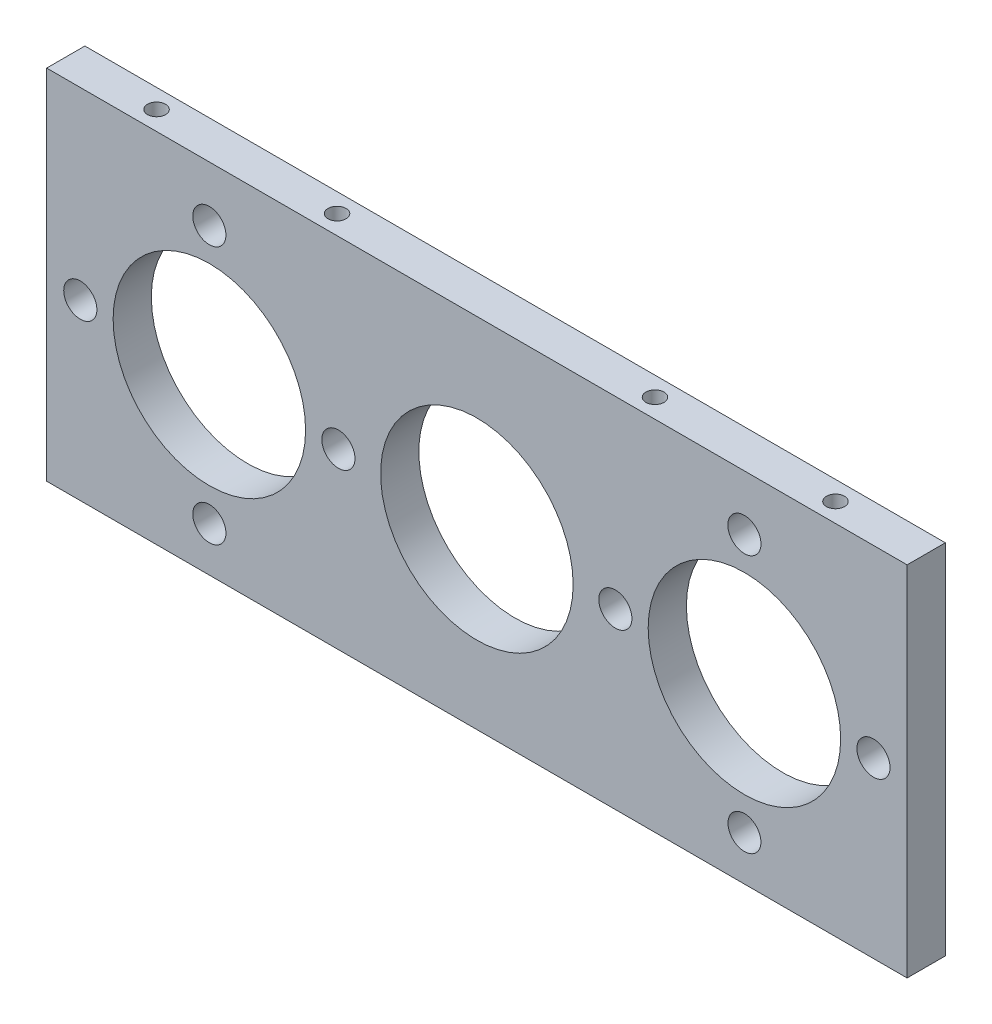
ISO-10303-21;
HEADER;
FILE_DESCRIPTION(('STEP AP214'),'2;1');
FILE_NAME('part.step','',(''),(''),'','','');
FILE_SCHEMA(('AUTOMOTIVE_DESIGN { 1 0 10303 214 1 1 1 1 }'));
ENDSEC;
DATA;
#1=APPLICATION_CONTEXT('core data for automotive mechanical design processes');
#2=APPLICATION_PROTOCOL_DEFINITION('international standard','automotive_design',2000,#1);
#3=PRODUCT_CONTEXT('',#1,'mechanical');
#4=PRODUCT('Part','Part','',(#3));
#5=PRODUCT_RELATED_PRODUCT_CATEGORY('part','',(#4));
#6=PRODUCT_DEFINITION_FORMATION('','',#4);
#7=PRODUCT_DEFINITION_CONTEXT('part definition',#1,'design');
#8=PRODUCT_DEFINITION('design','',#6,#7);
#9=PRODUCT_DEFINITION_SHAPE('','',#8);
#10=(LENGTH_UNIT() NAMED_UNIT(*) SI_UNIT(.MILLI.,.METRE.));
#11=(NAMED_UNIT(*) PLANE_ANGLE_UNIT() SI_UNIT($,.RADIAN.));
#12=(NAMED_UNIT(*) SI_UNIT($,.STERADIAN.) SOLID_ANGLE_UNIT());
#13=UNCERTAINTY_MEASURE_WITH_UNIT(LENGTH_MEASURE(1.E-05),#10,'distance_accuracy_value','');
#14=(GEOMETRIC_REPRESENTATION_CONTEXT(3) GLOBAL_UNCERTAINTY_ASSIGNED_CONTEXT((#13)) GLOBAL_UNIT_ASSIGNED_CONTEXT((#10,
#11,#12)) REPRESENTATION_CONTEXT('',''));
#15=CARTESIAN_POINT('',(0.,0.,0.));
#16=DIRECTION('',(0.,0.,1.));
#17=DIRECTION('',(1.,0.,0.));
#18=AXIS2_PLACEMENT_3D('',#15,#16,#17);
#19=CARTESIAN_POINT('',(-71.505,27.025,6.35));
#20=DIRECTION('',(1.,0.,0.));
#21=DIRECTION('',(0.,0.,-1.));
#22=AXIS2_PLACEMENT_3D('',#19,#20,#21);
#23=PLANE('',#22);
#24=DIRECTION('',(0.,-1.,0.));
#25=VECTOR('',#24,1.);
#26=CARTESIAN_POINT('',(-71.505,27.025,0.));
#27=LINE('',#26,#25);
#28=CARTESIAN_POINT('',(-71.505,32.445,0.));
#29=VERTEX_POINT('',#28);
#30=CARTESIAN_POINT('',(-71.505,-27.025,0.));
#31=VERTEX_POINT('',#30);
#32=EDGE_CURVE('E67',#29,#31,#27,.T.);
#33=ORIENTED_EDGE('',*,*,#32,.T.);
#34=DIRECTION('',(0.,0.,-1.));
#35=VECTOR('',#34,1.);
#36=CARTESIAN_POINT('',(-71.505,-27.025,6.35));
#37=LINE('',#36,#35);
#38=CARTESIAN_POINT('',(-71.505,-27.025,6.35));
#39=VERTEX_POINT('',#38);
#40=EDGE_CURVE('E11',#39,#31,#37,.T.);
#41=ORIENTED_EDGE('',*,*,#40,.F.);
#42=DIRECTION('',(0.,-1.,0.));
#43=VECTOR('',#42,1.);
#44=CARTESIAN_POINT('',(-71.505,27.025,6.35));
#45=LINE('',#44,#43);
#46=CARTESIAN_POINT('',(-71.505,32.445,6.35));
#47=VERTEX_POINT('',#46);
#48=EDGE_CURVE('E77',#47,#39,#45,.T.);
#49=ORIENTED_EDGE('',*,*,#48,.F.);
#50=DIRECTION('',(0.,0.,1.));
#51=VECTOR('',#50,1.);
#52=CARTESIAN_POINT('',(-71.505,32.445,0.));
#53=LINE('',#52,#51);
#54=EDGE_CURVE('E79',#29,#47,#53,.T.);
#55=ORIENTED_EDGE('',*,*,#54,.F.);
#56=EDGE_LOOP('',(#33,#41,#49,#55));
#57=FACE_BOUND('',#56,.T.);
#58=ADVANCED_FACE('F34',(#57),#23,.F.);
#59=CARTESIAN_POINT('',(-71.505,-27.025,6.35));
#60=DIRECTION('',(0.,1.,0.));
#61=DIRECTION('',(0.,0.,1.));
#62=AXIS2_PLACEMENT_3D('',#59,#60,#61);
#63=PLANE('',#62);
#64=DIRECTION('',(1.,0.,0.));
#65=VECTOR('',#64,1.);
#66=CARTESIAN_POINT('',(-71.505,-27.025,0.));
#67=LINE('',#66,#65);
#68=CARTESIAN_POINT('',(71.505,-27.025,0.));
#69=VERTEX_POINT('',#68);
#70=EDGE_CURVE('E62',#31,#69,#67,.T.);
#71=ORIENTED_EDGE('',*,*,#70,.T.);
#72=DIRECTION('',(0.,0.,-1.));
#73=VECTOR('',#72,1.);
#74=CARTESIAN_POINT('',(71.505,-27.025,6.35));
#75=LINE('',#74,#73);
#76=CARTESIAN_POINT('',(71.505,-27.025,6.35));
#77=VERTEX_POINT('',#76);
#78=EDGE_CURVE('E43',#77,#69,#75,.T.);
#79=ORIENTED_EDGE('',*,*,#78,.F.);
#80=DIRECTION('',(1.,0.,0.));
#81=VECTOR('',#80,1.);
#82=CARTESIAN_POINT('',(-71.505,-27.025,6.35));
#83=LINE('',#82,#81);
#84=EDGE_CURVE('E51',#39,#77,#83,.T.);
#85=ORIENTED_EDGE('',*,*,#84,.F.);
#86=ORIENTED_EDGE('',*,*,#40,.T.);
#87=EDGE_LOOP('',(#71,#79,#85,#86));
#88=FACE_BOUND('',#87,.T.);
#89=ADVANCED_FACE('F195',(#88),#63,.F.);
#90=CARTESIAN_POINT('',(71.505,27.025,6.35));
#91=DIRECTION('',(-1.,0.,0.));
#92=DIRECTION('',(0.,0.,1.));
#93=AXIS2_PLACEMENT_3D('',#90,#91,#92);
#94=PLANE('',#93);
#95=DIRECTION('',(0.,1.,0.));
#96=VECTOR('',#95,1.);
#97=CARTESIAN_POINT('',(71.505,27.025,0.));
#98=LINE('',#97,#96);
#99=CARTESIAN_POINT('',(71.505,32.445,0.));
#100=VERTEX_POINT('',#99);
#101=EDGE_CURVE('E82',#69,#100,#98,.T.);
#102=ORIENTED_EDGE('',*,*,#101,.T.);
#103=DIRECTION('',(0.,0.,1.));
#104=VECTOR('',#103,1.);
#105=CARTESIAN_POINT('',(71.505,32.445,0.));
#106=LINE('',#105,#104);
#107=CARTESIAN_POINT('',(71.505,32.445,6.35));
#108=VERTEX_POINT('',#107);
#109=EDGE_CURVE('E91',#100,#108,#106,.T.);
#110=ORIENTED_EDGE('',*,*,#109,.T.);
#111=DIRECTION('',(0.,1.,0.));
#112=VECTOR('',#111,1.);
#113=CARTESIAN_POINT('',(71.505,27.025,6.35));
#114=LINE('',#113,#112);
#115=EDGE_CURVE('E95',#77,#108,#114,.T.);
#116=ORIENTED_EDGE('',*,*,#115,.F.);
#117=ORIENTED_EDGE('',*,*,#78,.T.);
#118=EDGE_LOOP('',(#102,#110,#116,#117));
#119=FACE_BOUND('',#118,.T.);
#120=ADVANCED_FACE('F175',(#119),#94,.F.);
#121=CARTESIAN_POINT('',(-71.505,-27.025,6.35));
#122=DIRECTION('',(0.,0.,1.));
#123=DIRECTION('',(1.,0.,0.));
#124=AXIS2_PLACEMENT_3D('',#121,#122,#123);
#125=PLANE('',#124);
#126=CARTESIAN_POINT('',(-0.00186307186936935,1.8418504493771,6.35));
#127=DIRECTION('',(0.,0.,1.));
#128=DIRECTION('',(1.,0.,0.));
#129=AXIS2_PLACEMENT_3D('',#126,#127,#128);
#130=CIRCLE('',#129,16.);
#131=CARTESIAN_POINT('',(15.9981369281306,1.8418504493771,6.35));
#132=VERTEX_POINT('',#131);
#133=EDGE_CURVE('E90',#132,#132,#130,.T.);
#134=ORIENTED_EDGE('',*,*,#133,.F.);
#135=EDGE_LOOP('',(#134));
#136=FACE_BOUND('',#135,.T.);
#137=CARTESIAN_POINT('',(-44.4668630718694,1.84185044937741,6.35));
#138=DIRECTION('',(0.,0.,1.));
#139=DIRECTION('',(1.,0.,0.));
#140=AXIS2_PLACEMENT_3D('',#137,#138,#139);
#141=CIRCLE('',#140,15.995);
#142=CARTESIAN_POINT('',(-28.4718630718694,1.84185044937741,6.35));
#143=VERTEX_POINT('',#142);
#144=EDGE_CURVE('E111',#143,#143,#141,.T.);
#145=ORIENTED_EDGE('',*,*,#144,.F.);
#146=EDGE_LOOP('',(#145));
#147=FACE_BOUND('',#146,.T.);
#148=CARTESIAN_POINT('',(44.4631369281306,1.8418504493771,6.35));
#149=DIRECTION('',(0.,0.,1.));
#150=DIRECTION('',(1.,0.,0.));
#151=AXIS2_PLACEMENT_3D('',#148,#149,#150);
#152=CIRCLE('',#151,15.995);
#153=CARTESIAN_POINT('',(60.4581369281306,1.8418504493771,6.35));
#154=VERTEX_POINT('',#153);
#155=EDGE_CURVE('E117',#154,#154,#152,.T.);
#156=ORIENTED_EDGE('',*,*,#155,.F.);
#157=EDGE_LOOP('',(#156));
#158=FACE_BOUND('',#157,.T.);
#159=CARTESIAN_POINT('',(-44.4668630718693,23.2918504493774,6.35));
#160=DIRECTION('',(0.,0.,1.));
#161=DIRECTION('',(1.,0.,0.));
#162=AXIS2_PLACEMENT_3D('',#159,#160,#161);
#163=CIRCLE('',#162,2.755);
#164=CARTESIAN_POINT('',(-41.7118630718693,23.2918504493774,6.35));
#165=VERTEX_POINT('',#164);
#166=EDGE_CURVE('E123',#165,#165,#163,.F.);
#167=ORIENTED_EDGE('',*,*,#166,.T.);
#168=EDGE_LOOP('',(#167));
#169=FACE_BOUND('',#168,.T.);
#170=CARTESIAN_POINT('',(-65.9168630718694,1.84185044937741,6.35));
#171=DIRECTION('',(0.,0.,1.));
#172=DIRECTION('',(1.,0.,0.));
#173=AXIS2_PLACEMENT_3D('',#170,#171,#172);
#174=CIRCLE('',#173,2.75500000000001);
#175=CARTESIAN_POINT('',(-63.1618630718694,1.84185044937741,6.35));
#176=VERTEX_POINT('',#175);
#177=EDGE_CURVE('E129',#176,#176,#174,.F.);
#178=ORIENTED_EDGE('',*,*,#177,.T.);
#179=EDGE_LOOP('',(#178));
#180=FACE_BOUND('',#179,.T.);
#181=CARTESIAN_POINT('',(-44.4668630718696,-19.6081495506226,6.35));
#182=DIRECTION('',(0.,0.,1.));
#183=DIRECTION('',(1.,0.,0.));
#184=AXIS2_PLACEMENT_3D('',#181,#182,#183);
#185=CIRCLE('',#184,2.755);
#186=CARTESIAN_POINT('',(-41.7118630718696,-19.6081495506226,6.35));
#187=VERTEX_POINT('',#186);
#188=EDGE_CURVE('E135',#187,#187,#185,.F.);
#189=ORIENTED_EDGE('',*,*,#188,.T.);
#190=EDGE_LOOP('',(#189));
#191=FACE_BOUND('',#190,.T.);
#192=CARTESIAN_POINT('',(-23.0168630718694,1.84185044937726,6.35));
#193=DIRECTION('',(0.,0.,1.));
#194=DIRECTION('',(1.,0.,0.));
#195=AXIS2_PLACEMENT_3D('',#192,#193,#194);
#196=CIRCLE('',#195,2.755);
#197=CARTESIAN_POINT('',(-20.2618630718694,1.84185044937726,6.35));
#198=VERTEX_POINT('',#197);
#199=EDGE_CURVE('E141',#198,#198,#196,.F.);
#200=ORIENTED_EDGE('',*,*,#199,.T.);
#201=EDGE_LOOP('',(#200));
#202=FACE_BOUND('',#201,.T.);
#203=CARTESIAN_POINT('',(23.0131369281306,1.8418504493771,6.35));
#204=DIRECTION('',(0.,0.,1.));
#205=DIRECTION('',(1.,0.,0.));
#206=AXIS2_PLACEMENT_3D('',#203,#204,#205);
#207=CIRCLE('',#206,2.755);
#208=CARTESIAN_POINT('',(25.7681369281306,1.8418504493771,6.35));
#209=VERTEX_POINT('',#208);
#210=EDGE_CURVE('E147',#209,#209,#207,.F.);
#211=ORIENTED_EDGE('',*,*,#210,.T.);
#212=EDGE_LOOP('',(#211));
#213=FACE_BOUND('',#212,.T.);
#214=CARTESIAN_POINT('',(44.4631369281304,-19.6081495506229,6.35));
#215=DIRECTION('',(0.,0.,1.));
#216=DIRECTION('',(1.,0.,0.));
#217=AXIS2_PLACEMENT_3D('',#214,#215,#216);
#218=CIRCLE('',#217,2.73569173748039);
#219=CARTESIAN_POINT('',(47.1988286656108,-19.6081495506229,6.35));
#220=VERTEX_POINT('',#219);
#221=EDGE_CURVE('E153',#220,#220,#218,.F.);
#222=ORIENTED_EDGE('',*,*,#221,.T.);
#223=EDGE_LOOP('',(#222));
#224=FACE_BOUND('',#223,.T.);
#225=CARTESIAN_POINT('',(65.9131369281306,1.84185044937695,6.35));
#226=DIRECTION('',(0.,0.,1.));
#227=DIRECTION('',(1.,0.,0.));
#228=AXIS2_PLACEMENT_3D('',#225,#226,#227);
#229=CIRCLE('',#228,2.75556539322486);
#230=CARTESIAN_POINT('',(68.6687023213555,1.84185044937695,6.35));
#231=VERTEX_POINT('',#230);
#232=EDGE_CURVE('E159',#231,#231,#229,.F.);
#233=ORIENTED_EDGE('',*,*,#232,.T.);
#234=EDGE_LOOP('',(#233));
#235=FACE_BOUND('',#234,.T.);
#236=CARTESIAN_POINT('',(44.4631369281307,23.2918504493771,6.35));
#237=DIRECTION('',(0.,0.,1.));
#238=DIRECTION('',(1.,0.,0.));
#239=AXIS2_PLACEMENT_3D('',#236,#237,#238);
#240=CIRCLE('',#239,2.755);
#241=CARTESIAN_POINT('',(47.2181369281307,23.2918504493771,6.35));
#242=VERTEX_POINT('',#241);
#243=EDGE_CURVE('E165',#242,#242,#240,.F.);
#244=ORIENTED_EDGE('',*,*,#243,.T.);
#245=EDGE_LOOP('',(#244));
#246=FACE_BOUND('',#245,.T.);
#247=ORIENTED_EDGE('',*,*,#48,.T.);
#248=ORIENTED_EDGE('',*,*,#84,.T.);
#249=ORIENTED_EDGE('',*,*,#115,.T.);
#250=DIRECTION('',(-1.,0.,0.));
#251=VECTOR('',#250,1.);
#252=CARTESIAN_POINT('',(-71.505,32.445,6.35));
#253=LINE('',#252,#251);
#254=EDGE_CURVE('E88',#108,#47,#253,.T.);
#255=ORIENTED_EDGE('',*,*,#254,.T.);
#256=EDGE_LOOP('',(#247,#248,#249,#255));
#257=FACE_BOUND('',#256,.T.);
#258=ADVANCED_FACE('F93',(#136,#147,#158,#169,#180,#191,#202,#213,#224,#235,#246,#257),#125,.T.);
#259=CARTESIAN_POINT('',(-71.505,-27.025,0.));
#260=DIRECTION('',(0.,0.,1.));
#261=DIRECTION('',(1.,0.,0.));
#262=AXIS2_PLACEMENT_3D('',#259,#260,#261);
#263=PLANE('',#262);
#264=CARTESIAN_POINT('',(-0.00186307186936935,1.8418504493771,0.));
#265=DIRECTION('',(0.,0.,1.));
#266=DIRECTION('',(1.,0.,0.));
#267=AXIS2_PLACEMENT_3D('',#264,#265,#266);
#268=CIRCLE('',#267,16.);
#269=CARTESIAN_POINT('',(15.9981369281306,1.8418504493771,0.));
#270=VERTEX_POINT('',#269);
#271=EDGE_CURVE('E37',#270,#270,#268,.T.);
#272=ORIENTED_EDGE('',*,*,#271,.T.);
#273=EDGE_LOOP('',(#272));
#274=FACE_BOUND('',#273,.T.);
#275=CARTESIAN_POINT('',(-44.4668630718694,1.84185044937741,0.));
#276=DIRECTION('',(0.,0.,-1.));
#277=DIRECTION('',(-1.,0.,0.));
#278=AXIS2_PLACEMENT_3D('',#275,#276,#277);
#279=CIRCLE('',#278,15.995);
#280=CARTESIAN_POINT('',(-60.4618630718694,1.84185044937741,0.));
#281=VERTEX_POINT('',#280);
#282=EDGE_CURVE('E108',#281,#281,#279,.T.);
#283=ORIENTED_EDGE('',*,*,#282,.F.);
#284=EDGE_LOOP('',(#283));
#285=FACE_BOUND('',#284,.T.);
#286=CARTESIAN_POINT('',(44.4631369281306,1.8418504493771,0.));
#287=DIRECTION('',(0.,0.,-1.));
#288=DIRECTION('',(-1.,0.,0.));
#289=AXIS2_PLACEMENT_3D('',#286,#287,#288);
#290=CIRCLE('',#289,15.995);
#291=CARTESIAN_POINT('',(28.4681369281306,1.8418504493771,0.));
#292=VERTEX_POINT('',#291);
#293=EDGE_CURVE('E114',#292,#292,#290,.T.);
#294=ORIENTED_EDGE('',*,*,#293,.F.);
#295=EDGE_LOOP('',(#294));
#296=FACE_BOUND('',#295,.T.);
#297=CARTESIAN_POINT('',(-44.4668630718693,23.2918504493774,0.));
#298=DIRECTION('',(0.,0.,-1.));
#299=DIRECTION('',(-1.,0.,0.));
#300=AXIS2_PLACEMENT_3D('',#297,#298,#299);
#301=CIRCLE('',#300,2.755);
#302=CARTESIAN_POINT('',(-47.2218630718693,23.2918504493774,0.));
#303=VERTEX_POINT('',#302);
#304=EDGE_CURVE('E120',#303,#303,#301,.T.);
#305=ORIENTED_EDGE('',*,*,#304,.F.);
#306=EDGE_LOOP('',(#305));
#307=FACE_BOUND('',#306,.T.);
#308=CARTESIAN_POINT('',(-65.9168630718694,1.84185044937741,0.));
#309=DIRECTION('',(0.,0.,-1.));
#310=DIRECTION('',(-1.,0.,0.));
#311=AXIS2_PLACEMENT_3D('',#308,#309,#310);
#312=CIRCLE('',#311,2.75500000000001);
#313=CARTESIAN_POINT('',(-68.6718630718694,1.84185044937741,0.));
#314=VERTEX_POINT('',#313);
#315=EDGE_CURVE('E126',#314,#314,#312,.T.);
#316=ORIENTED_EDGE('',*,*,#315,.F.);
#317=EDGE_LOOP('',(#316));
#318=FACE_BOUND('',#317,.T.);
#319=CARTESIAN_POINT('',(-44.4668630718696,-19.6081495506226,0.));
#320=DIRECTION('',(0.,0.,-1.));
#321=DIRECTION('',(-1.,0.,0.));
#322=AXIS2_PLACEMENT_3D('',#319,#320,#321);
#323=CIRCLE('',#322,2.755);
#324=CARTESIAN_POINT('',(-47.2218630718696,-19.6081495506226,0.));
#325=VERTEX_POINT('',#324);
#326=EDGE_CURVE('E132',#325,#325,#323,.T.);
#327=ORIENTED_EDGE('',*,*,#326,.F.);
#328=EDGE_LOOP('',(#327));
#329=FACE_BOUND('',#328,.T.);
#330=CARTESIAN_POINT('',(-23.0168630718694,1.84185044937726,0.));
#331=DIRECTION('',(0.,0.,-1.));
#332=DIRECTION('',(-1.,0.,0.));
#333=AXIS2_PLACEMENT_3D('',#330,#331,#332);
#334=CIRCLE('',#333,2.755);
#335=CARTESIAN_POINT('',(-25.7718630718694,1.84185044937726,0.));
#336=VERTEX_POINT('',#335);
#337=EDGE_CURVE('E138',#336,#336,#334,.T.);
#338=ORIENTED_EDGE('',*,*,#337,.F.);
#339=EDGE_LOOP('',(#338));
#340=FACE_BOUND('',#339,.T.);
#341=CARTESIAN_POINT('',(23.0131369281306,1.8418504493771,0.));
#342=DIRECTION('',(0.,0.,-1.));
#343=DIRECTION('',(-1.,0.,0.));
#344=AXIS2_PLACEMENT_3D('',#341,#342,#343);
#345=CIRCLE('',#344,2.755);
#346=CARTESIAN_POINT('',(20.2581369281306,1.8418504493771,0.));
#347=VERTEX_POINT('',#346);
#348=EDGE_CURVE('E144',#347,#347,#345,.T.);
#349=ORIENTED_EDGE('',*,*,#348,.F.);
#350=EDGE_LOOP('',(#349));
#351=FACE_BOUND('',#350,.T.);
#352=CARTESIAN_POINT('',(44.4631369281304,-19.6081495506229,0.));
#353=DIRECTION('',(0.,0.,-1.));
#354=DIRECTION('',(-1.,0.,0.));
#355=AXIS2_PLACEMENT_3D('',#352,#353,#354);
#356=CIRCLE('',#355,2.73569173748039);
#357=CARTESIAN_POINT('',(41.72744519065,-19.6081495506229,0.));
#358=VERTEX_POINT('',#357);
#359=EDGE_CURVE('E150',#358,#358,#356,.T.);
#360=ORIENTED_EDGE('',*,*,#359,.F.);
#361=EDGE_LOOP('',(#360));
#362=FACE_BOUND('',#361,.T.);
#363=CARTESIAN_POINT('',(65.9131369281306,1.84185044937695,0.));
#364=DIRECTION('',(0.,0.,-1.));
#365=DIRECTION('',(-1.,0.,0.));
#366=AXIS2_PLACEMENT_3D('',#363,#364,#365);
#367=CIRCLE('',#366,2.75556539322486);
#368=CARTESIAN_POINT('',(63.1575715349058,1.84185044937695,0.));
#369=VERTEX_POINT('',#368);
#370=EDGE_CURVE('E156',#369,#369,#367,.T.);
#371=ORIENTED_EDGE('',*,*,#370,.F.);
#372=EDGE_LOOP('',(#371));
#373=FACE_BOUND('',#372,.T.);
#374=CARTESIAN_POINT('',(44.4631369281307,23.2918504493771,0.));
#375=DIRECTION('',(0.,0.,-1.));
#376=DIRECTION('',(-1.,0.,0.));
#377=AXIS2_PLACEMENT_3D('',#374,#375,#376);
#378=CIRCLE('',#377,2.755);
#379=CARTESIAN_POINT('',(41.7081369281307,23.2918504493771,0.));
#380=VERTEX_POINT('',#379);
#381=EDGE_CURVE('E162',#380,#380,#378,.T.);
#382=ORIENTED_EDGE('',*,*,#381,.F.);
#383=EDGE_LOOP('',(#382));
#384=FACE_BOUND('',#383,.T.);
#385=ORIENTED_EDGE('',*,*,#32,.F.);
#386=DIRECTION('',(-1.,0.,0.));
#387=VECTOR('',#386,1.);
#388=CARTESIAN_POINT('',(-71.505,32.445,0.));
#389=LINE('',#388,#387);
#390=EDGE_CURVE('E89',#100,#29,#389,.T.);
#391=ORIENTED_EDGE('',*,*,#390,.F.);
#392=ORIENTED_EDGE('',*,*,#101,.F.);
#393=ORIENTED_EDGE('',*,*,#70,.F.);
#394=EDGE_LOOP('',(#385,#391,#392,#393));
#395=FACE_BOUND('',#394,.T.);
#396=ADVANCED_FACE('F177',(#274,#285,#296,#307,#318,#329,#340,#351,#362,#373,#384,#395),#263,.F.);
#397=CARTESIAN_POINT('',(44.4631369281307,23.2918504493771,14.1439159022091));
#398=DIRECTION('',(0.,0.,-1.));
#399=DIRECTION('',(-1.,0.,0.));
#400=AXIS2_PLACEMENT_3D('',#397,#398,#399);
#401=CYLINDRICAL_SURFACE('',#400,2.755);
#402=ORIENTED_EDGE('',*,*,#381,.T.);
#403=EDGE_LOOP('',(#402));
#404=FACE_BOUND('',#403,.T.);
#405=ORIENTED_EDGE('',*,*,#243,.F.);
#406=EDGE_LOOP('',(#405));
#407=FACE_BOUND('',#406,.T.);
#408=ADVANCED_FACE('F179',(#404,#407),#401,.F.);
#409=CARTESIAN_POINT('',(65.9131369281306,1.84185044937695,14.1439159022091));
#410=DIRECTION('',(0.,0.,-1.));
#411=DIRECTION('',(-1.,0.,0.));
#412=AXIS2_PLACEMENT_3D('',#409,#410,#411);
#413=CYLINDRICAL_SURFACE('',#412,2.75556539322486);
#414=ORIENTED_EDGE('',*,*,#370,.T.);
#415=EDGE_LOOP('',(#414));
#416=FACE_BOUND('',#415,.T.);
#417=ORIENTED_EDGE('',*,*,#232,.F.);
#418=EDGE_LOOP('',(#417));
#419=FACE_BOUND('',#418,.T.);
#420=ADVANCED_FACE('F186',(#416,#419),#413,.F.);
#421=CARTESIAN_POINT('',(44.4631369281304,-19.6081495506229,14.1439159022091));
#422=DIRECTION('',(0.,0.,-1.));
#423=DIRECTION('',(-1.,0.,0.));
#424=AXIS2_PLACEMENT_3D('',#421,#422,#423);
#425=CYLINDRICAL_SURFACE('',#424,2.73569173748039);
#426=ORIENTED_EDGE('',*,*,#359,.T.);
#427=EDGE_LOOP('',(#426));
#428=FACE_BOUND('',#427,.T.);
#429=ORIENTED_EDGE('',*,*,#221,.F.);
#430=EDGE_LOOP('',(#429));
#431=FACE_BOUND('',#430,.T.);
#432=ADVANCED_FACE('F397',(#428,#431),#425,.F.);
#433=CARTESIAN_POINT('',(23.0131369281306,1.8418504493771,14.1439159022091));
#434=DIRECTION('',(0.,0.,-1.));
#435=DIRECTION('',(-1.,0.,0.));
#436=AXIS2_PLACEMENT_3D('',#433,#434,#435);
#437=CYLINDRICAL_SURFACE('',#436,2.755);
#438=ORIENTED_EDGE('',*,*,#348,.T.);
#439=EDGE_LOOP('',(#438));
#440=FACE_BOUND('',#439,.T.);
#441=ORIENTED_EDGE('',*,*,#210,.F.);
#442=EDGE_LOOP('',(#441));
#443=FACE_BOUND('',#442,.T.);
#444=ADVANCED_FACE('F389',(#440,#443),#437,.F.);
#445=CARTESIAN_POINT('',(-23.0168630718694,1.84185044937726,14.1439159022091));
#446=DIRECTION('',(0.,0.,-1.));
#447=DIRECTION('',(-1.,0.,0.));
#448=AXIS2_PLACEMENT_3D('',#445,#446,#447);
#449=CYLINDRICAL_SURFACE('',#448,2.755);
#450=ORIENTED_EDGE('',*,*,#337,.T.);
#451=EDGE_LOOP('',(#450));
#452=FACE_BOUND('',#451,.T.);
#453=ORIENTED_EDGE('',*,*,#199,.F.);
#454=EDGE_LOOP('',(#453));
#455=FACE_BOUND('',#454,.T.);
#456=ADVANCED_FACE('F381',(#452,#455),#449,.F.);
#457=CARTESIAN_POINT('',(-44.4668630718696,-19.6081495506226,14.1439159022091));
#458=DIRECTION('',(0.,0.,-1.));
#459=DIRECTION('',(-1.,0.,0.));
#460=AXIS2_PLACEMENT_3D('',#457,#458,#459);
#461=CYLINDRICAL_SURFACE('',#460,2.755);
#462=ORIENTED_EDGE('',*,*,#326,.T.);
#463=EDGE_LOOP('',(#462));
#464=FACE_BOUND('',#463,.T.);
#465=ORIENTED_EDGE('',*,*,#188,.F.);
#466=EDGE_LOOP('',(#465));
#467=FACE_BOUND('',#466,.T.);
#468=ADVANCED_FACE('F373',(#464,#467),#461,.F.);
#469=CARTESIAN_POINT('',(-65.9168630718694,1.84185044937741,14.1439159022091));
#470=DIRECTION('',(0.,0.,-1.));
#471=DIRECTION('',(-1.,0.,0.));
#472=AXIS2_PLACEMENT_3D('',#469,#470,#471);
#473=CYLINDRICAL_SURFACE('',#472,2.75500000000001);
#474=ORIENTED_EDGE('',*,*,#315,.T.);
#475=EDGE_LOOP('',(#474));
#476=FACE_BOUND('',#475,.T.);
#477=ORIENTED_EDGE('',*,*,#177,.F.);
#478=EDGE_LOOP('',(#477));
#479=FACE_BOUND('',#478,.T.);
#480=ADVANCED_FACE('F365',(#476,#479),#473,.F.);
#481=CARTESIAN_POINT('',(-44.4668630718693,23.2918504493774,14.1439159022091));
#482=DIRECTION('',(0.,0.,-1.));
#483=DIRECTION('',(-1.,0.,0.));
#484=AXIS2_PLACEMENT_3D('',#481,#482,#483);
#485=CYLINDRICAL_SURFACE('',#484,2.755);
#486=ORIENTED_EDGE('',*,*,#304,.T.);
#487=EDGE_LOOP('',(#486));
#488=FACE_BOUND('',#487,.T.);
#489=ORIENTED_EDGE('',*,*,#166,.F.);
#490=EDGE_LOOP('',(#489));
#491=FACE_BOUND('',#490,.T.);
#492=ADVANCED_FACE('F357',(#488,#491),#485,.F.);
#493=CARTESIAN_POINT('',(44.4631369281306,1.8418504493771,10.));
#494=DIRECTION('',(0.,0.,-1.));
#495=DIRECTION('',(-1.,0.,0.));
#496=AXIS2_PLACEMENT_3D('',#493,#494,#495);
#497=CYLINDRICAL_SURFACE('',#496,15.995);
#498=ORIENTED_EDGE('',*,*,#155,.T.);
#499=EDGE_LOOP('',(#498));
#500=FACE_BOUND('',#499,.T.);
#501=ORIENTED_EDGE('',*,*,#293,.T.);
#502=EDGE_LOOP('',(#501));
#503=FACE_BOUND('',#502,.T.);
#504=ADVANCED_FACE('F349',(#500,#503),#497,.F.);
#505=CARTESIAN_POINT('',(-44.4668630718694,1.84185044937741,10.));
#506=DIRECTION('',(0.,0.,-1.));
#507=DIRECTION('',(-1.,0.,0.));
#508=AXIS2_PLACEMENT_3D('',#505,#506,#507);
#509=CYLINDRICAL_SURFACE('',#508,15.995);
#510=ORIENTED_EDGE('',*,*,#144,.T.);
#511=EDGE_LOOP('',(#510));
#512=FACE_BOUND('',#511,.T.);
#513=ORIENTED_EDGE('',*,*,#282,.T.);
#514=EDGE_LOOP('',(#513));
#515=FACE_BOUND('',#514,.T.);
#516=ADVANCED_FACE('F344',(#512,#515),#509,.F.);
#517=CARTESIAN_POINT('',(-0.00186307186936935,1.8418504493771,-3.65));
#518=DIRECTION('',(0.,0.,1.));
#519=DIRECTION('',(1.,0.,0.));
#520=AXIS2_PLACEMENT_3D('',#517,#518,#519);
#521=CYLINDRICAL_SURFACE('',#520,16.);
#522=ORIENTED_EDGE('',*,*,#133,.T.);
#523=EDGE_LOOP('',(#522));
#524=FACE_BOUND('',#523,.T.);
#525=ORIENTED_EDGE('',*,*,#271,.F.);
#526=EDGE_LOOP('',(#525));
#527=FACE_BOUND('',#526,.T.);
#528=ADVANCED_FACE('F231',(#524,#527),#521,.F.);
#529=CARTESIAN_POINT('',(-71.505,32.445,0.));
#530=DIRECTION('',(0.,1.,0.));
#531=DIRECTION('',(0.,0.,1.));
#532=AXIS2_PLACEMENT_3D('',#529,#530,#531);
#533=PLANE('',#532);
#534=CARTESIAN_POINT('',(-56.423186497269,32.445,3.175));
#535=DIRECTION('',(0.,1.,0.));
#536=DIRECTION('',(0.,0.,-1.));
#537=AXIS2_PLACEMENT_3D('',#534,#535,#536);
#538=CIRCLE('',#537,1.5);
#539=CARTESIAN_POINT('',(-56.423186497269,32.445,1.67499999999999));
#540=VERTEX_POINT('',#539);
#541=EDGE_CURVE('E510',#540,#540,#538,.T.);
#542=ORIENTED_EDGE('',*,*,#541,.F.);
#543=EDGE_LOOP('',(#542));
#544=FACE_BOUND('',#543,.T.);
#545=CARTESIAN_POINT('',(-26.423186497269,32.445,3.17499999999999));
#546=DIRECTION('',(0.,1.,0.));
#547=DIRECTION('',(0.,0.,-1.));
#548=AXIS2_PLACEMENT_3D('',#545,#546,#547);
#549=CIRCLE('',#548,1.5);
#550=CARTESIAN_POINT('',(-26.423186497269,32.445,1.67499999999999));
#551=VERTEX_POINT('',#550);
#552=EDGE_CURVE('E509',#551,#551,#549,.T.);
#553=ORIENTED_EDGE('',*,*,#552,.F.);
#554=EDGE_LOOP('',(#553));
#555=FACE_BOUND('',#554,.T.);
#556=CARTESIAN_POINT('',(26.423186497269,32.445,3.17499999999999));
#557=DIRECTION('',(0.,1.,0.));
#558=DIRECTION('',(0.,0.,1.));
#559=AXIS2_PLACEMENT_3D('',#556,#557,#558);
#560=CIRCLE('',#559,1.5);
#561=CARTESIAN_POINT('',(26.423186497269,32.445,4.67499999999999));
#562=VERTEX_POINT('',#561);
#563=EDGE_CURVE('E519',#562,#562,#560,.T.);
#564=ORIENTED_EDGE('',*,*,#563,.F.);
#565=EDGE_LOOP('',(#564));
#566=FACE_BOUND('',#565,.T.);
#567=CARTESIAN_POINT('',(56.423186497269,32.445,3.17499999999998));
#568=DIRECTION('',(0.,1.,0.));
#569=DIRECTION('',(0.,0.,1.));
#570=AXIS2_PLACEMENT_3D('',#567,#568,#569);
#571=CIRCLE('',#570,1.5);
#572=CARTESIAN_POINT('',(56.423186497269,32.445,4.67499999999999));
#573=VERTEX_POINT('',#572);
#574=EDGE_CURVE('E101',#573,#573,#571,.T.);
#575=ORIENTED_EDGE('',*,*,#574,.F.);
#576=EDGE_LOOP('',(#575));
#577=FACE_BOUND('',#576,.T.);
#578=ORIENTED_EDGE('',*,*,#254,.F.);
#579=ORIENTED_EDGE('',*,*,#109,.F.);
#580=ORIENTED_EDGE('',*,*,#390,.T.);
#581=ORIENTED_EDGE('',*,*,#54,.T.);
#582=EDGE_LOOP('',(#578,#579,#580,#581));
#583=FACE_BOUND('',#582,.T.);
#584=ADVANCED_FACE('F86',(#544,#555,#566,#577,#583),#533,.T.);
#585=CARTESIAN_POINT('',(56.423186497269,15.445,3.17499999999998));
#586=DIRECTION('',(0.,1.,0.));
#587=DIRECTION('',(0.,0.,1.));
#588=AXIS2_PLACEMENT_3D('',#585,#586,#587);
#589=CYLINDRICAL_SURFACE('',#588,1.5);
#590=CARTESIAN_POINT('',(56.423186497269,15.445,3.17499999999998));
#591=DIRECTION('',(0.,1.,0.));
#592=DIRECTION('',(0.,0.,1.));
#593=AXIS2_PLACEMENT_3D('',#590,#591,#592);
#594=CIRCLE('',#593,1.5);
#595=CARTESIAN_POINT('',(56.423186497269,15.445,4.67499999999999));
#596=VERTEX_POINT('',#595);
#597=EDGE_CURVE('E97',#596,#596,#594,.T.);
#598=ORIENTED_EDGE('',*,*,#597,.F.);
#599=EDGE_LOOP('',(#598));
#600=FACE_BOUND('',#599,.T.);
#601=ORIENTED_EDGE('',*,*,#574,.T.);
#602=EDGE_LOOP('',(#601));
#603=FACE_BOUND('',#602,.T.);
#604=ADVANCED_FACE('F259',(#600,#603),#589,.F.);
#605=CARTESIAN_POINT('',(56.423186497269,15.445,3.17499999999998));
#606=DIRECTION('',(0.,1.,0.));
#607=DIRECTION('',(0.,0.,1.));
#608=AXIS2_PLACEMENT_3D('',#605,#606,#607);
#609=PLANE('',#608);
#610=ORIENTED_EDGE('',*,*,#597,.T.);
#611=EDGE_LOOP('',(#610));
#612=FACE_BOUND('',#611,.T.);
#613=ADVANCED_FACE('F268',(#612),#609,.T.);
#614=CARTESIAN_POINT('',(26.423186497269,15.445,3.17499999999999));
#615=DIRECTION('',(0.,1.,0.));
#616=DIRECTION('',(0.,0.,1.));
#617=AXIS2_PLACEMENT_3D('',#614,#615,#616);
#618=CYLINDRICAL_SURFACE('',#617,1.5);
#619=CARTESIAN_POINT('',(26.423186497269,15.445,3.17499999999999));
#620=DIRECTION('',(0.,1.,0.));
#621=DIRECTION('',(0.,0.,1.));
#622=AXIS2_PLACEMENT_3D('',#619,#620,#621);
#623=CIRCLE('',#622,1.5);
#624=CARTESIAN_POINT('',(26.423186497269,15.445,4.67499999999999));
#625=VERTEX_POINT('',#624);
#626=EDGE_CURVE('E521',#625,#625,#623,.T.);
#627=ORIENTED_EDGE('',*,*,#626,.F.);
#628=EDGE_LOOP('',(#627));
#629=FACE_BOUND('',#628,.T.);
#630=ORIENTED_EDGE('',*,*,#563,.T.);
#631=EDGE_LOOP('',(#630));
#632=FACE_BOUND('',#631,.T.);
#633=ADVANCED_FACE('F277',(#629,#632),#618,.F.);
#634=CARTESIAN_POINT('',(26.423186497269,15.445,3.17499999999999));
#635=DIRECTION('',(0.,1.,0.));
#636=DIRECTION('',(0.,0.,1.));
#637=AXIS2_PLACEMENT_3D('',#634,#635,#636);
#638=PLANE('',#637);
#639=ORIENTED_EDGE('',*,*,#626,.T.);
#640=EDGE_LOOP('',(#639));
#641=FACE_BOUND('',#640,.T.);
#642=ADVANCED_FACE('F286',(#641),#638,.T.);
#643=CARTESIAN_POINT('',(-26.423186497269,15.445,3.17499999999999));
#644=DIRECTION('',(0.,1.,0.));
#645=DIRECTION('',(0.,0.,1.));
#646=AXIS2_PLACEMENT_3D('',#643,#644,#645);
#647=CYLINDRICAL_SURFACE('',#646,1.5);
#648=CARTESIAN_POINT('',(-26.423186497269,15.445,3.17499999999999));
#649=DIRECTION('',(0.,1.,0.));
#650=DIRECTION('',(0.,0.,-1.));
#651=AXIS2_PLACEMENT_3D('',#648,#649,#650);
#652=CIRCLE('',#651,1.5);
#653=CARTESIAN_POINT('',(-26.423186497269,15.445,1.67499999999999));
#654=VERTEX_POINT('',#653);
#655=EDGE_CURVE('E513',#654,#654,#652,.T.);
#656=ORIENTED_EDGE('',*,*,#655,.F.);
#657=EDGE_LOOP('',(#656));
#658=FACE_BOUND('',#657,.T.);
#659=ORIENTED_EDGE('',*,*,#552,.T.);
#660=EDGE_LOOP('',(#659));
#661=FACE_BOUND('',#660,.T.);
#662=ADVANCED_FACE('F295',(#658,#661),#647,.F.);
#663=CARTESIAN_POINT('',(-26.423186497269,15.445,3.17499999999999));
#664=DIRECTION('',(0.,-1.,0.));
#665=DIRECTION('',(0.,0.,-1.));
#666=AXIS2_PLACEMENT_3D('',#663,#664,#665);
#667=PLANE('',#666);
#668=ORIENTED_EDGE('',*,*,#655,.T.);
#669=EDGE_LOOP('',(#668));
#670=FACE_BOUND('',#669,.T.);
#671=ADVANCED_FACE('F304',(#670),#667,.F.);
#672=CARTESIAN_POINT('',(-56.423186497269,15.445,3.175));
#673=DIRECTION('',(0.,1.,0.));
#674=DIRECTION('',(0.,0.,1.));
#675=AXIS2_PLACEMENT_3D('',#672,#673,#674);
#676=CYLINDRICAL_SURFACE('',#675,1.5);
#677=CARTESIAN_POINT('',(-56.423186497269,15.445,3.175));
#678=DIRECTION('',(0.,1.,0.));
#679=DIRECTION('',(0.,0.,-1.));
#680=AXIS2_PLACEMENT_3D('',#677,#678,#679);
#681=CIRCLE('',#680,1.5);
#682=CARTESIAN_POINT('',(-56.423186497269,15.445,1.67499999999999));
#683=VERTEX_POINT('',#682);
#684=EDGE_CURVE('E508',#683,#683,#681,.T.);
#685=ORIENTED_EDGE('',*,*,#684,.F.);
#686=EDGE_LOOP('',(#685));
#687=FACE_BOUND('',#686,.T.);
#688=ORIENTED_EDGE('',*,*,#541,.T.);
#689=EDGE_LOOP('',(#688));
#690=FACE_BOUND('',#689,.T.);
#691=ADVANCED_FACE('F313',(#687,#690),#676,.F.);
#692=CARTESIAN_POINT('',(-56.423186497269,15.445,3.175));
#693=DIRECTION('',(0.,-1.,0.));
#694=DIRECTION('',(0.,0.,-1.));
#695=AXIS2_PLACEMENT_3D('',#692,#693,#694);
#696=PLANE('',#695);
#697=ORIENTED_EDGE('',*,*,#684,.T.);
#698=EDGE_LOOP('',(#697));
#699=FACE_BOUND('',#698,.T.);
#700=ADVANCED_FACE('F322',(#699),#696,.F.);
#701=CLOSED_SHELL('',(#58,#89,#120,#258,#396,#408,#420,#432,#444,#456,#468,#480,#492,#504,#516,
#528,#584,#604,#613,#633,#642,#662,#671,#691,#700));
#702=MANIFOLD_SOLID_BREP('B2',#701);
#703=ADVANCED_BREP_SHAPE_REPRESENTATION('',(#18,#702),#14);
#704=SHAPE_DEFINITION_REPRESENTATION(#9,#703);
ENDSEC;
END-ISO-10303-21;
